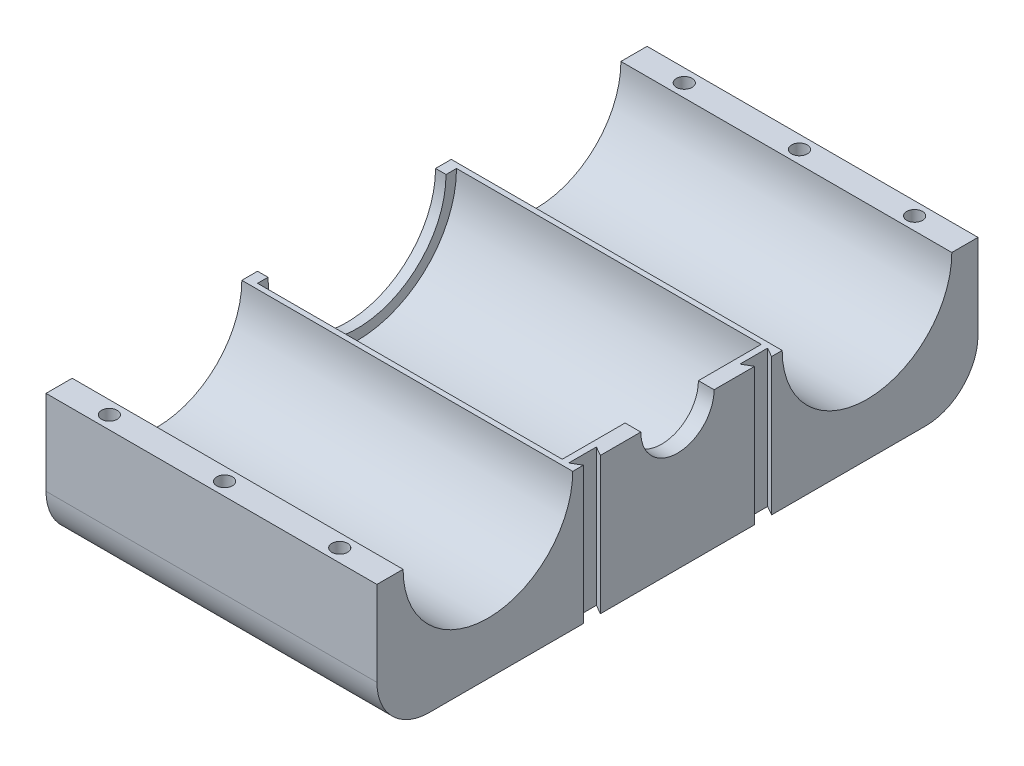
ISO-10303-21;
HEADER;
FILE_DESCRIPTION(('STEP AP214'),'2;1');
FILE_NAME('part.step','',(''),(''),'','','');
FILE_SCHEMA(('AUTOMOTIVE_DESIGN { 1 0 10303 214 1 1 1 1 }'));
ENDSEC;
DATA;
#1=APPLICATION_CONTEXT('core data for automotive mechanical design processes');
#2=APPLICATION_PROTOCOL_DEFINITION('international standard','automotive_design',2000,#1);
#3=PRODUCT_CONTEXT('',#1,'mechanical');
#4=PRODUCT('Part','Part','',(#3));
#5=PRODUCT_RELATED_PRODUCT_CATEGORY('part','',(#4));
#6=PRODUCT_DEFINITION_FORMATION('','',#4);
#7=PRODUCT_DEFINITION_CONTEXT('part definition',#1,'design');
#8=PRODUCT_DEFINITION('design','',#6,#7);
#9=PRODUCT_DEFINITION_SHAPE('','',#8);
#10=(LENGTH_UNIT() NAMED_UNIT(*) SI_UNIT(.MILLI.,.METRE.));
#11=(NAMED_UNIT(*) PLANE_ANGLE_UNIT() SI_UNIT($,.RADIAN.));
#12=(NAMED_UNIT(*) SI_UNIT($,.STERADIAN.) SOLID_ANGLE_UNIT());
#13=UNCERTAINTY_MEASURE_WITH_UNIT(LENGTH_MEASURE(1.E-05),#10,'distance_accuracy_value','');
#14=(GEOMETRIC_REPRESENTATION_CONTEXT(3) GLOBAL_UNCERTAINTY_ASSIGNED_CONTEXT((#13)) GLOBAL_UNIT_ASSIGNED_CONTEXT((#10,
#11,#12)) REPRESENTATION_CONTEXT('',''));
#15=CARTESIAN_POINT('',(0.,0.,0.));
#16=DIRECTION('',(0.,0.,1.));
#17=DIRECTION('',(1.,0.,0.));
#18=AXIS2_PLACEMENT_3D('',#15,#16,#17);
#19=CARTESIAN_POINT('',(116.940115370178,26.2,-57.4));
#20=DIRECTION('',(-1.,0.,0.));
#21=DIRECTION('',(0.,0.,1.));
#22=AXIS2_PLACEMENT_3D('',#19,#20,#21);
#23=CYLINDRICAL_SURFACE('',#22,19.);
#24=CARTESIAN_POINT('',(2.,26.2,-57.4));
#25=DIRECTION('',(-1.,0.,0.));
#26=DIRECTION('',(0.,0.,1.));
#27=AXIS2_PLACEMENT_3D('',#24,#25,#26);
#28=CIRCLE('',#27,19.);
#29=CARTESIAN_POINT('',(2.,26.2,-76.4));
#30=VERTEX_POINT('',#29);
#31=CARTESIAN_POINT('',(2.,26.2,-38.4));
#32=VERTEX_POINT('',#31);
#33=EDGE_CURVE('E207',#30,#32,#28,.T.);
#34=ORIENTED_EDGE('',*,*,#33,.T.);
#35=DIRECTION('',(-1.,0.,0.));
#36=VECTOR('',#35,1.);
#37=CARTESIAN_POINT('',(116.940115370178,26.2,-38.4));
#38=LINE('',#37,#36);
#39=CARTESIAN_POINT('',(60.2,26.2,-38.4));
#40=VERTEX_POINT('',#39);
#41=EDGE_CURVE('E218',#32,#40,#38,.F.);
#42=ORIENTED_EDGE('',*,*,#41,.T.);
#43=CARTESIAN_POINT('',(60.2,26.2,-57.4));
#44=DIRECTION('',(1.,0.,0.));
#45=DIRECTION('',(0.,0.,-1.));
#46=AXIS2_PLACEMENT_3D('',#43,#44,#45);
#47=CIRCLE('',#46,19.);
#48=CARTESIAN_POINT('',(60.2,26.2,-76.4));
#49=VERTEX_POINT('',#48);
#50=EDGE_CURVE('E229',#49,#40,#47,.F.);
#51=ORIENTED_EDGE('',*,*,#50,.F.);
#52=DIRECTION('',(-1.,0.,0.));
#53=VECTOR('',#52,1.);
#54=CARTESIAN_POINT('',(116.940115370178,26.2,-76.4));
#55=LINE('',#54,#53);
#56=EDGE_CURVE('E221',#49,#30,#55,.T.);
#57=ORIENTED_EDGE('',*,*,#56,.T.);
#58=EDGE_LOOP('',(#34,#42,#51,#57));
#59=FACE_BOUND('',#58,.T.);
#60=ADVANCED_FACE('F41',(#59),#23,.F.);
#61=CARTESIAN_POINT('',(63.2,26.2,0.));
#62=DIRECTION('',(0.,1.,0.));
#63=DIRECTION('',(0.,0.,1.));
#64=AXIS2_PLACEMENT_3D('',#61,#62,#63);
#65=PLANE('',#64);
#66=DIRECTION('',(1.,0.,0.));
#67=VECTOR('',#66,1.);
#68=CARTESIAN_POINT('',(-0.001000000000001,26.2,-50.4));
#69=LINE('',#68,#67);
#70=CARTESIAN_POINT('',(63.2,26.2,-50.4));
#71=VERTEX_POINT('',#70);
#72=CARTESIAN_POINT('',(60.2,26.2,-50.4));
#73=VERTEX_POINT('',#72);
#74=EDGE_CURVE('E418',#71,#73,#69,.F.);
#75=ORIENTED_EDGE('',*,*,#74,.T.);
#76=DIRECTION('',(0.,0.,-1.));
#77=VECTOR('',#76,1.);
#78=CARTESIAN_POINT('',(60.2,26.2,0.));
#79=LINE('',#78,#77);
#80=EDGE_CURVE('E228',#40,#73,#79,.T.);
#81=ORIENTED_EDGE('',*,*,#80,.F.);
#82=ORIENTED_EDGE('',*,*,#41,.F.);
#83=DIRECTION('',(0.,0.,-1.));
#84=VECTOR('',#83,1.);
#85=CARTESIAN_POINT('',(2.,26.2,-40.4));
#86=LINE('',#85,#84);
#87=CARTESIAN_POINT('',(2.,26.2,-40.4));
#88=VERTEX_POINT('',#87);
#89=EDGE_CURVE('E203',#32,#88,#86,.T.);
#90=ORIENTED_EDGE('',*,*,#89,.T.);
#91=DIRECTION('',(-1.,0.,0.));
#92=VECTOR('',#91,1.);
#93=CARTESIAN_POINT('',(2.,26.2,-40.4));
#94=LINE('',#93,#92);
#95=CARTESIAN_POINT('',(0.,26.2,-40.4));
#96=VERTEX_POINT('',#95);
#97=EDGE_CURVE('E398',#88,#96,#94,.T.);
#98=ORIENTED_EDGE('',*,*,#97,.T.);
#99=DIRECTION('',(0.,0.,-1.));
#100=VECTOR('',#99,1.);
#101=CARTESIAN_POINT('',(0.,26.2,0.));
#102=LINE('',#101,#100);
#103=CARTESIAN_POINT('',(0.,26.2,-37.4));
#104=VERTEX_POINT('',#103);
#105=EDGE_CURVE('E319',#104,#96,#102,.T.);
#106=ORIENTED_EDGE('',*,*,#105,.F.);
#107=DIRECTION('',(-1.,0.,0.));
#108=VECTOR('',#107,1.);
#109=CARTESIAN_POINT('',(63.2,26.2,-37.4));
#110=LINE('',#109,#108);
#111=CARTESIAN_POINT('',(63.2,26.2,-37.4));
#112=VERTEX_POINT('',#111);
#113=EDGE_CURVE('E344',#112,#104,#110,.T.);
#114=ORIENTED_EDGE('',*,*,#113,.F.);
#115=DIRECTION('',(0.,0.,-1.));
#116=VECTOR('',#115,1.);
#117=CARTESIAN_POINT('',(63.2,26.2,0.));
#118=LINE('',#117,#116);
#119=CARTESIAN_POINT('',(63.2,26.2,-39.425));
#120=VERTEX_POINT('',#119);
#121=EDGE_CURVE('E293',#112,#120,#118,.T.);
#122=ORIENTED_EDGE('',*,*,#121,.T.);
#123=DIRECTION('',(0.866025403784429,0.,-0.500000000000017));
#124=VECTOR('',#123,1.);
#125=CARTESIAN_POINT('',(61.4246479222421,26.2,-38.4));
#126=LINE('',#125,#124);
#127=CARTESIAN_POINT('',(61.4246479222421,26.2,-38.4));
#128=VERTEX_POINT('',#127);
#129=EDGE_CURVE('E276',#128,#120,#126,.T.);
#130=ORIENTED_EDGE('',*,*,#129,.F.);
#131=DIRECTION('',(0.,0.,1.));
#132=VECTOR('',#131,1.);
#133=CARTESIAN_POINT('',(61.424647922242,26.2,-43.7));
#134=LINE('',#133,#132);
#135=CARTESIAN_POINT('',(61.424647922242,26.2,-43.7));
#136=VERTEX_POINT('',#135);
#137=EDGE_CURVE('E273',#136,#128,#134,.T.);
#138=ORIENTED_EDGE('',*,*,#137,.F.);
#139=DIRECTION('',(-0.866025403784443,0.,-0.499999999999993));
#140=VECTOR('',#139,1.);
#141=CARTESIAN_POINT('',(63.2,26.2,-42.6750000000001));
#142=LINE('',#141,#140);
#143=CARTESIAN_POINT('',(63.2,26.2,-42.6750000000001));
#144=VERTEX_POINT('',#143);
#145=EDGE_CURVE('E270',#144,#136,#142,.T.);
#146=ORIENTED_EDGE('',*,*,#145,.F.);
#147=EDGE_CURVE('E297',#144,#71,#118,.T.);
#148=ORIENTED_EDGE('',*,*,#147,.T.);
#149=EDGE_LOOP('',(#75,#81,#82,#90,#98,#106,#114,#122,#130,#138,#146,#148));
#150=FACE_BOUND('',#149,.T.);
#151=ADVANCED_FACE('F226',(#150),#65,.T.);
#152=CARTESIAN_POINT('',(63.2,0.,0.));
#153=DIRECTION('',(1.,0.,0.));
#154=DIRECTION('',(0.,0.,-1.));
#155=AXIS2_PLACEMENT_3D('',#152,#153,#154);
#156=PLANE('',#155);
#157=CARTESIAN_POINT('',(63.2,26.2,-57.4));
#158=DIRECTION('',(1.,0.,0.));
#159=DIRECTION('',(0.,0.,-1.));
#160=AXIS2_PLACEMENT_3D('',#157,#158,#159);
#161=CIRCLE('',#160,7.);
#162=CARTESIAN_POINT('',(63.2,26.2,-64.4));
#163=VERTEX_POINT('',#162);
#164=EDGE_CURVE('E420',#71,#163,#161,.T.);
#165=ORIENTED_EDGE('',*,*,#164,.F.);
#166=ORIENTED_EDGE('',*,*,#147,.F.);
#167=DIRECTION('',(0.,1.,0.));
#168=VECTOR('',#167,1.);
#169=CARTESIAN_POINT('',(63.2,-0.001000000000001,-42.6750000000001));
#170=LINE('',#169,#168);
#171=CARTESIAN_POINT('',(63.2,0.,-42.6750000000001));
#172=VERTEX_POINT('',#171);
#173=EDGE_CURVE('E278',#172,#144,#170,.T.);
#174=ORIENTED_EDGE('',*,*,#173,.F.);
#175=DIRECTION('',(0.,0.,-1.));
#176=VECTOR('',#175,1.);
#177=CARTESIAN_POINT('',(63.2,0.,0.));
#178=LINE('',#177,#176);
#179=CARTESIAN_POINT('',(63.2,0.,-72.1249999999997));
#180=VERTEX_POINT('',#179);
#181=EDGE_CURVE('E310',#172,#180,#178,.T.);
#182=ORIENTED_EDGE('',*,*,#181,.T.);
#183=DIRECTION('',(0.,1.,0.));
#184=VECTOR('',#183,1.);
#185=CARTESIAN_POINT('',(63.2,-0.001000000000001,-72.1249999999997));
#186=LINE('',#185,#184);
#187=CARTESIAN_POINT('',(63.2,26.2,-72.1249999999997));
#188=VERTEX_POINT('',#187);
#189=EDGE_CURVE('E254',#180,#188,#186,.T.);
#190=ORIENTED_EDGE('',*,*,#189,.T.);
#191=EDGE_CURVE('E298',#163,#188,#118,.T.);
#192=ORIENTED_EDGE('',*,*,#191,.F.);
#193=EDGE_LOOP('',(#165,#166,#174,#182,#190,#192));
#194=FACE_BOUND('',#193,.T.);
#195=ADVANCED_FACE('F499',(#194),#156,.T.);
#196=DIRECTION('',(0.,1.,0.));
#197=VECTOR('',#196,1.);
#198=CARTESIAN_POINT('',(63.2,0.,0.));
#199=LINE('',#198,#197);
#200=CARTESIAN_POINT('',(63.2,10.,0.));
#201=VERTEX_POINT('',#200);
#202=CARTESIAN_POINT('',(63.2,26.2,0.));
#203=VERTEX_POINT('',#202);
#204=EDGE_CURVE('E304',#201,#203,#199,.T.);
#205=ORIENTED_EDGE('',*,*,#204,.F.);
#206=CARTESIAN_POINT('',(63.2,10.,-10.));
#207=DIRECTION('',(1.,0.,0.));
#208=DIRECTION('',(0.,0.,-1.));
#209=AXIS2_PLACEMENT_3D('',#206,#207,#208);
#210=CIRCLE('',#209,10.);
#211=CARTESIAN_POINT('',(63.2,0.,-10.));
#212=VERTEX_POINT('',#211);
#213=EDGE_CURVE('E12',#201,#212,#210,.T.);
#214=ORIENTED_EDGE('',*,*,#213,.T.);
#215=CARTESIAN_POINT('',(63.2,0.,-39.425));
#216=VERTEX_POINT('',#215);
#217=EDGE_CURVE('E307',#212,#216,#178,.T.);
#218=ORIENTED_EDGE('',*,*,#217,.T.);
#219=DIRECTION('',(0.,1.,0.));
#220=VECTOR('',#219,1.);
#221=CARTESIAN_POINT('',(63.2,-0.001000000000001,-39.425));
#222=LINE('',#221,#220);
#223=EDGE_CURVE('E279',#216,#120,#222,.T.);
#224=ORIENTED_EDGE('',*,*,#223,.T.);
#225=ORIENTED_EDGE('',*,*,#121,.F.);
#226=CARTESIAN_POINT('',(63.2,26.2,-21.2));
#227=DIRECTION('',(1.,0.,0.));
#228=DIRECTION('',(0.,0.,-1.));
#229=AXIS2_PLACEMENT_3D('',#226,#227,#228);
#230=CIRCLE('',#229,16.2);
#231=CARTESIAN_POINT('',(63.2,26.2,-5.));
#232=VERTEX_POINT('',#231);
#233=EDGE_CURVE('E296',#232,#112,#230,.T.);
#234=ORIENTED_EDGE('',*,*,#233,.F.);
#235=DIRECTION('',(0.,0.,-1.));
#236=VECTOR('',#235,1.);
#237=CARTESIAN_POINT('',(63.2,26.2,0.));
#238=LINE('',#237,#236);
#239=EDGE_CURVE('E301',#203,#232,#238,.T.);
#240=ORIENTED_EDGE('',*,*,#239,.F.);
#241=EDGE_LOOP('',(#205,#214,#218,#224,#225,#234,#240));
#242=FACE_BOUND('',#241,.T.);
#243=ADVANCED_FACE('F545',(#242),#156,.T.);
#244=CARTESIAN_POINT('',(63.2,26.2,-93.6));
#245=DIRECTION('',(-1.,0.,0.));
#246=DIRECTION('',(0.,0.,1.));
#247=AXIS2_PLACEMENT_3D('',#244,#245,#246);
#248=CYLINDRICAL_SURFACE('',#247,16.2);
#249=CARTESIAN_POINT('',(0.,26.2,-93.6));
#250=DIRECTION('',(1.,0.,0.));
#251=DIRECTION('',(0.,0.,-1.));
#252=AXIS2_PLACEMENT_3D('',#249,#250,#251);
#253=CIRCLE('',#252,16.2);
#254=CARTESIAN_POINT('',(0.,26.2,-77.4));
#255=VERTEX_POINT('',#254);
#256=CARTESIAN_POINT('',(0.,26.2,-109.8));
#257=VERTEX_POINT('',#256);
#258=EDGE_CURVE('E264',#255,#257,#253,.T.);
#259=ORIENTED_EDGE('',*,*,#258,.F.);
#260=DIRECTION('',(-1.,0.,0.));
#261=VECTOR('',#260,1.);
#262=CARTESIAN_POINT('',(63.2,26.2,-77.4));
#263=LINE('',#262,#261);
#264=CARTESIAN_POINT('',(63.2,26.2,-77.4));
#265=VERTEX_POINT('',#264);
#266=EDGE_CURVE('E346',#265,#255,#263,.T.);
#267=ORIENTED_EDGE('',*,*,#266,.F.);
#268=CARTESIAN_POINT('',(63.2,26.2,-93.6));
#269=DIRECTION('',(1.,0.,0.));
#270=DIRECTION('',(0.,0.,-1.));
#271=AXIS2_PLACEMENT_3D('',#268,#269,#270);
#272=CIRCLE('',#271,16.2);
#273=CARTESIAN_POINT('',(63.2,26.2,-109.8));
#274=VERTEX_POINT('',#273);
#275=EDGE_CURVE('E288',#265,#274,#272,.T.);
#276=ORIENTED_EDGE('',*,*,#275,.T.);
#277=DIRECTION('',(-1.,0.,0.));
#278=VECTOR('',#277,1.);
#279=CARTESIAN_POINT('',(63.2,26.2,-109.8));
#280=LINE('',#279,#278);
#281=EDGE_CURVE('E315',#274,#257,#280,.T.);
#282=ORIENTED_EDGE('',*,*,#281,.T.);
#283=EDGE_LOOP('',(#259,#267,#276,#282));
#284=FACE_BOUND('',#283,.T.);
#285=ADVANCED_FACE('F487',(#284),#248,.F.);
#286=DIRECTION('',(1.,0.,0.));
#287=VECTOR('',#286,1.);
#288=CARTESIAN_POINT('',(-0.001000000000001,26.2,-64.4));
#289=LINE('',#288,#287);
#290=CARTESIAN_POINT('',(60.2,26.2,-64.4));
#291=VERTEX_POINT('',#290);
#292=EDGE_CURVE('E414',#291,#163,#289,.T.);
#293=ORIENTED_EDGE('',*,*,#292,.T.);
#294=ORIENTED_EDGE('',*,*,#191,.T.);
#295=DIRECTION('',(0.866025403784411,0.,-0.500000000000048));
#296=VECTOR('',#295,1.);
#297=CARTESIAN_POINT('',(61.4246479222421,26.2,-71.0999999999997));
#298=LINE('',#297,#296);
#299=CARTESIAN_POINT('',(61.4246479222421,26.2,-71.0999999999997));
#300=VERTEX_POINT('',#299);
#301=EDGE_CURVE('E250',#300,#188,#298,.T.);
#302=ORIENTED_EDGE('',*,*,#301,.F.);
#303=DIRECTION('',(0.,0.,1.));
#304=VECTOR('',#303,1.);
#305=CARTESIAN_POINT('',(61.4246479222421,26.2,-76.4));
#306=LINE('',#305,#304);
#307=CARTESIAN_POINT('',(61.4246479222421,26.2,-76.4));
#308=VERTEX_POINT('',#307);
#309=EDGE_CURVE('E247',#308,#300,#306,.T.);
#310=ORIENTED_EDGE('',*,*,#309,.F.);
#311=DIRECTION('',(-0.866025403784364,0.,-0.500000000000129));
#312=VECTOR('',#311,1.);
#313=CARTESIAN_POINT('',(63.2,26.2,-75.3749999999997));
#314=LINE('',#313,#312);
#315=CARTESIAN_POINT('',(63.2,26.2,-75.3749999999997));
#316=VERTEX_POINT('',#315);
#317=EDGE_CURVE('E244',#316,#308,#314,.T.);
#318=ORIENTED_EDGE('',*,*,#317,.F.);
#319=EDGE_CURVE('E291',#316,#265,#118,.T.);
#320=ORIENTED_EDGE('',*,*,#319,.T.);
#321=ORIENTED_EDGE('',*,*,#266,.T.);
#322=CARTESIAN_POINT('',(0.,26.2,-74.4));
#323=VERTEX_POINT('',#322);
#324=EDGE_CURVE('E318',#323,#255,#102,.T.);
#325=ORIENTED_EDGE('',*,*,#324,.F.);
#326=DIRECTION('',(-1.,0.,0.));
#327=VECTOR('',#326,1.);
#328=CARTESIAN_POINT('',(2.,26.2,-74.4));
#329=LINE('',#328,#327);
#330=CARTESIAN_POINT('',(2.,26.2,-74.4));
#331=VERTEX_POINT('',#330);
#332=EDGE_CURVE('E401',#331,#323,#329,.T.);
#333=ORIENTED_EDGE('',*,*,#332,.F.);
#334=DIRECTION('',(0.,0.,-1.));
#335=VECTOR('',#334,1.);
#336=CARTESIAN_POINT('',(2.,26.2,-74.4));
#337=LINE('',#336,#335);
#338=EDGE_CURVE('E402',#331,#30,#337,.T.);
#339=ORIENTED_EDGE('',*,*,#338,.T.);
#340=ORIENTED_EDGE('',*,*,#56,.F.);
#341=EDGE_CURVE('E349',#291,#49,#79,.T.);
#342=ORIENTED_EDGE('',*,*,#341,.F.);
#343=EDGE_LOOP('',(#293,#294,#302,#310,#318,#320,#321,#325,#333,#339,#340,#342));
#344=FACE_BOUND('',#343,.T.);
#345=ADVANCED_FACE('F432',(#344),#65,.T.);
#346=CARTESIAN_POINT('',(63.2,26.2,-21.2));
#347=DIRECTION('',(-1.,0.,0.));
#348=DIRECTION('',(0.,0.,1.));
#349=AXIS2_PLACEMENT_3D('',#346,#347,#348);
#350=CYLINDRICAL_SURFACE('',#349,16.2);
#351=CARTESIAN_POINT('',(0.,26.2,-21.2));
#352=DIRECTION('',(1.,0.,0.));
#353=DIRECTION('',(0.,0.,-1.));
#354=AXIS2_PLACEMENT_3D('',#351,#352,#353);
#355=CIRCLE('',#354,16.2);
#356=CARTESIAN_POINT('',(0.,26.2,-5.));
#357=VERTEX_POINT('',#356);
#358=EDGE_CURVE('E321',#357,#104,#355,.T.);
#359=ORIENTED_EDGE('',*,*,#358,.F.);
#360=DIRECTION('',(-1.,0.,0.));
#361=VECTOR('',#360,1.);
#362=CARTESIAN_POINT('',(63.2,26.2,-5.));
#363=LINE('',#362,#361);
#364=EDGE_CURVE('E342',#232,#357,#363,.T.);
#365=ORIENTED_EDGE('',*,*,#364,.F.);
#366=ORIENTED_EDGE('',*,*,#233,.T.);
#367=ORIENTED_EDGE('',*,*,#113,.T.);
#368=EDGE_LOOP('',(#359,#365,#366,#367));
#369=FACE_BOUND('',#368,.T.);
#370=ADVANCED_FACE('F395',(#369),#350,.F.);
#371=CARTESIAN_POINT('',(63.2,26.2,0.));
#372=DIRECTION('',(0.,1.,0.));
#373=DIRECTION('',(0.,0.,1.));
#374=AXIS2_PLACEMENT_3D('',#371,#372,#373);
#375=PLANE('',#374);
#376=CARTESIAN_POINT('',(9.60000000000003,26.2000000000002,-2.50000000000001));
#377=DIRECTION('',(0.,1.,0.));
#378=DIRECTION('',(0.,0.,-1.));
#379=AXIS2_PLACEMENT_3D('',#376,#377,#378);
#380=CIRCLE('',#379,1.5);
#381=CARTESIAN_POINT('',(9.60000000000003,26.2000000000002,-4.00000000000001));
#382=VERTEX_POINT('',#381);
#383=EDGE_CURVE('E437',#382,#382,#380,.T.);
#384=ORIENTED_EDGE('',*,*,#383,.F.);
#385=EDGE_LOOP('',(#384));
#386=FACE_BOUND('',#385,.T.);
#387=CARTESIAN_POINT('',(31.6,26.2000000000002,-2.50000000000001));
#388=DIRECTION('',(0.,1.,0.));
#389=DIRECTION('',(0.,0.,-1.));
#390=AXIS2_PLACEMENT_3D('',#387,#388,#389);
#391=CIRCLE('',#390,1.49999999999999);
#392=CARTESIAN_POINT('',(31.6,26.2000000000002,-4.));
#393=VERTEX_POINT('',#392);
#394=EDGE_CURVE('E443',#393,#393,#391,.T.);
#395=ORIENTED_EDGE('',*,*,#394,.F.);
#396=EDGE_LOOP('',(#395));
#397=FACE_BOUND('',#396,.T.);
#398=CARTESIAN_POINT('',(53.6,26.2000000000002,-2.50000000000001));
#399=DIRECTION('',(0.,1.,0.));
#400=DIRECTION('',(0.,0.,-1.));
#401=AXIS2_PLACEMENT_3D('',#398,#399,#400);
#402=CIRCLE('',#401,1.5);
#403=CARTESIAN_POINT('',(53.6,26.2000000000002,-4.00000000000002));
#404=VERTEX_POINT('',#403);
#405=EDGE_CURVE('E449',#404,#404,#402,.T.);
#406=ORIENTED_EDGE('',*,*,#405,.F.);
#407=EDGE_LOOP('',(#406));
#408=FACE_BOUND('',#407,.T.);
#409=DIRECTION('',(0.,0.,-1.));
#410=VECTOR('',#409,1.);
#411=CARTESIAN_POINT('',(0.,26.2,0.));
#412=LINE('',#411,#410);
#413=CARTESIAN_POINT('',(0.,26.2,0.));
#414=VERTEX_POINT('',#413);
#415=EDGE_CURVE('E324',#414,#357,#412,.T.);
#416=ORIENTED_EDGE('',*,*,#415,.F.);
#417=DIRECTION('',(-1.,0.,0.));
#418=VECTOR('',#417,1.);
#419=CARTESIAN_POINT('',(63.2,26.2,0.));
#420=LINE('',#419,#418);
#421=EDGE_CURVE('E339',#203,#414,#420,.T.);
#422=ORIENTED_EDGE('',*,*,#421,.F.);
#423=ORIENTED_EDGE('',*,*,#239,.T.);
#424=ORIENTED_EDGE('',*,*,#364,.T.);
#425=EDGE_LOOP('',(#416,#422,#423,#424));
#426=FACE_BOUND('',#425,.T.);
#427=ADVANCED_FACE('F390',(#386,#397,#408,#426),#375,.T.);
#428=CARTESIAN_POINT('',(63.2,0.,0.));
#429=DIRECTION('',(0.,0.,1.));
#430=DIRECTION('',(1.,0.,0.));
#431=AXIS2_PLACEMENT_3D('',#428,#429,#430);
#432=PLANE('',#431);
#433=DIRECTION('',(0.,1.,0.));
#434=VECTOR('',#433,1.);
#435=CARTESIAN_POINT('',(0.,0.,0.));
#436=LINE('',#435,#434);
#437=CARTESIAN_POINT('',(0.,10.,0.));
#438=VERTEX_POINT('',#437);
#439=EDGE_CURVE('E327',#438,#414,#436,.T.);
#440=ORIENTED_EDGE('',*,*,#439,.F.);
#441=DIRECTION('',(-1.,0.,0.));
#442=VECTOR('',#441,1.);
#443=CARTESIAN_POINT('',(63.2,10.,0.));
#444=LINE('',#443,#442);
#445=EDGE_CURVE('E49',#438,#201,#444,.F.);
#446=ORIENTED_EDGE('',*,*,#445,.T.);
#447=ORIENTED_EDGE('',*,*,#204,.T.);
#448=ORIENTED_EDGE('',*,*,#421,.T.);
#449=EDGE_LOOP('',(#440,#446,#447,#448));
#450=FACE_BOUND('',#449,.T.);
#451=ADVANCED_FACE('F385',(#450),#432,.T.);
#452=CARTESIAN_POINT('',(63.2,0.,0.));
#453=DIRECTION('',(0.,1.,0.));
#454=DIRECTION('',(0.,0.,1.));
#455=AXIS2_PLACEMENT_3D('',#452,#453,#454);
#456=PLANE('',#455);
#457=DIRECTION('',(0.,0.,-1.));
#458=VECTOR('',#457,1.);
#459=CARTESIAN_POINT('',(0.,0.,0.));
#460=LINE('',#459,#458);
#461=CARTESIAN_POINT('',(0.,0.,-10.));
#462=VERTEX_POINT('',#461);
#463=CARTESIAN_POINT('',(0.,0.,-104.8));
#464=VERTEX_POINT('',#463);
#465=EDGE_CURVE('E329',#462,#464,#460,.T.);
#466=ORIENTED_EDGE('',*,*,#465,.T.);
#467=DIRECTION('',(-1.,0.,0.));
#468=VECTOR('',#467,1.);
#469=CARTESIAN_POINT('',(63.2,0.,-104.8));
#470=LINE('',#469,#468);
#471=CARTESIAN_POINT('',(63.2,0.,-104.8));
#472=VERTEX_POINT('',#471);
#473=EDGE_CURVE('E63',#464,#472,#470,.F.);
#474=ORIENTED_EDGE('',*,*,#473,.T.);
#475=CARTESIAN_POINT('',(63.2,0.,-75.3749999999997));
#476=VERTEX_POINT('',#475);
#477=EDGE_CURVE('E306',#476,#472,#178,.T.);
#478=ORIENTED_EDGE('',*,*,#477,.F.);
#479=DIRECTION('',(0.866025403784365,0.,0.500000000000129));
#480=VECTOR('',#479,1.);
#481=CARTESIAN_POINT('',(63.2,0.,-75.3749999999997));
#482=LINE('',#481,#480);
#483=CARTESIAN_POINT('',(61.4246479222421,0.,-76.4));
#484=VERTEX_POINT('',#483);
#485=EDGE_CURVE('E257',#484,#476,#482,.T.);
#486=ORIENTED_EDGE('',*,*,#485,.F.);
#487=DIRECTION('',(0.,0.,-1.));
#488=VECTOR('',#487,1.);
#489=CARTESIAN_POINT('',(61.4246479222421,0.,-76.4));
#490=LINE('',#489,#488);
#491=CARTESIAN_POINT('',(61.4246479222421,0.,-71.0999999999997));
#492=VERTEX_POINT('',#491);
#493=EDGE_CURVE('E237',#492,#484,#490,.T.);
#494=ORIENTED_EDGE('',*,*,#493,.F.);
#495=DIRECTION('',(-0.866025403784411,0.,0.500000000000048));
#496=VECTOR('',#495,1.);
#497=CARTESIAN_POINT('',(61.4246479222421,0.,-71.0999999999997));
#498=LINE('',#497,#496);
#499=EDGE_CURVE('E240',#180,#492,#498,.T.);
#500=ORIENTED_EDGE('',*,*,#499,.F.);
#501=ORIENTED_EDGE('',*,*,#181,.F.);
#502=DIRECTION('',(0.866025403784443,0.,0.499999999999993));
#503=VECTOR('',#502,1.);
#504=CARTESIAN_POINT('',(63.2,0.,-42.6750000000001));
#505=LINE('',#504,#503);
#506=CARTESIAN_POINT('',(61.424647922242,0.,-43.7));
#507=VERTEX_POINT('',#506);
#508=EDGE_CURVE('E241',#507,#172,#505,.T.);
#509=ORIENTED_EDGE('',*,*,#508,.F.);
#510=DIRECTION('',(0.,0.,-1.));
#511=VECTOR('',#510,1.);
#512=CARTESIAN_POINT('',(61.424647922242,0.,-43.7));
#513=LINE('',#512,#511);
#514=CARTESIAN_POINT('',(61.4246479222421,0.,-38.4));
#515=VERTEX_POINT('',#514);
#516=EDGE_CURVE('E231',#515,#507,#513,.T.);
#517=ORIENTED_EDGE('',*,*,#516,.F.);
#518=DIRECTION('',(-0.866025403784429,0.,0.500000000000017));
#519=VECTOR('',#518,1.);
#520=CARTESIAN_POINT('',(61.4246479222421,0.,-38.4));
#521=LINE('',#520,#519);
#522=EDGE_CURVE('E267',#216,#515,#521,.T.);
#523=ORIENTED_EDGE('',*,*,#522,.F.);
#524=ORIENTED_EDGE('',*,*,#217,.F.);
#525=DIRECTION('',(-1.,0.,0.));
#526=VECTOR('',#525,1.);
#527=CARTESIAN_POINT('',(0.,0.,-10.));
#528=LINE('',#527,#526);
#529=EDGE_CURVE('E358',#212,#462,#528,.T.);
#530=ORIENTED_EDGE('',*,*,#529,.T.);
#531=EDGE_LOOP('',(#466,#474,#478,#486,#494,#500,#501,#509,#517,#523,#524,#530));
#532=FACE_BOUND('',#531,.T.);
#533=ADVANCED_FACE('F379',(#532),#456,.F.);
#534=CARTESIAN_POINT('',(63.2,0.,-114.8));
#535=DIRECTION('',(0.,0.,1.));
#536=DIRECTION('',(1.,0.,0.));
#537=AXIS2_PLACEMENT_3D('',#534,#535,#536);
#538=PLANE('',#537);
#539=DIRECTION('',(0.,1.,0.));
#540=VECTOR('',#539,1.);
#541=CARTESIAN_POINT('',(63.2,0.,-114.8));
#542=LINE('',#541,#540);
#543=CARTESIAN_POINT('',(63.2,10.,-114.8));
#544=VERTEX_POINT('',#543);
#545=CARTESIAN_POINT('',(63.2,26.2,-114.8));
#546=VERTEX_POINT('',#545);
#547=EDGE_CURVE('E309',#544,#546,#542,.T.);
#548=ORIENTED_EDGE('',*,*,#547,.F.);
#549=DIRECTION('',(-1.,0.,0.));
#550=VECTOR('',#549,1.);
#551=CARTESIAN_POINT('',(63.2,10.,-114.8));
#552=LINE('',#551,#550);
#553=CARTESIAN_POINT('',(0.,10.,-114.8));
#554=VERTEX_POINT('',#553);
#555=EDGE_CURVE('E351',#544,#554,#552,.T.);
#556=ORIENTED_EDGE('',*,*,#555,.T.);
#557=DIRECTION('',(0.,1.,0.));
#558=VECTOR('',#557,1.);
#559=CARTESIAN_POINT('',(0.,0.,-114.8));
#560=LINE('',#559,#558);
#561=CARTESIAN_POINT('',(0.,26.2,-114.8));
#562=VERTEX_POINT('',#561);
#563=EDGE_CURVE('E331',#554,#562,#560,.T.);
#564=ORIENTED_EDGE('',*,*,#563,.T.);
#565=DIRECTION('',(-1.,0.,0.));
#566=VECTOR('',#565,1.);
#567=CARTESIAN_POINT('',(63.2,26.2,-114.8));
#568=LINE('',#567,#566);
#569=EDGE_CURVE('E336',#546,#562,#568,.T.);
#570=ORIENTED_EDGE('',*,*,#569,.F.);
#571=EDGE_LOOP('',(#548,#556,#564,#570));
#572=FACE_BOUND('',#571,.T.);
#573=ADVANCED_FACE('F373',(#572),#538,.F.);
#574=CARTESIAN_POINT('',(63.2,26.2000000000002,0.));
#575=DIRECTION('',(0.,1.,0.));
#576=DIRECTION('',(0.,0.,1.));
#577=AXIS2_PLACEMENT_3D('',#574,#575,#576);
#578=PLANE('',#577);
#579=CARTESIAN_POINT('',(53.6,26.2,-112.3));
#580=DIRECTION('',(0.,1.,0.));
#581=DIRECTION('',(0.,0.,1.));
#582=AXIS2_PLACEMENT_3D('',#579,#580,#581);
#583=CIRCLE('',#582,1.5);
#584=CARTESIAN_POINT('',(53.6,26.2,-110.8));
#585=VERTEX_POINT('',#584);
#586=EDGE_CURVE('E455',#585,#585,#583,.T.);
#587=ORIENTED_EDGE('',*,*,#586,.F.);
#588=EDGE_LOOP('',(#587));
#589=FACE_BOUND('',#588,.T.);
#590=CARTESIAN_POINT('',(31.6,26.2,-112.3));
#591=DIRECTION('',(0.,1.,0.));
#592=DIRECTION('',(0.,0.,1.));
#593=AXIS2_PLACEMENT_3D('',#590,#591,#592);
#594=CIRCLE('',#593,1.5);
#595=CARTESIAN_POINT('',(31.6,26.2,-110.8));
#596=VERTEX_POINT('',#595);
#597=EDGE_CURVE('E461',#596,#596,#594,.T.);
#598=ORIENTED_EDGE('',*,*,#597,.F.);
#599=EDGE_LOOP('',(#598));
#600=FACE_BOUND('',#599,.T.);
#601=CARTESIAN_POINT('',(9.6,26.2,-112.3));
#602=DIRECTION('',(0.,1.,0.));
#603=DIRECTION('',(0.,0.,1.));
#604=AXIS2_PLACEMENT_3D('',#601,#602,#603);
#605=CIRCLE('',#604,1.5);
#606=CARTESIAN_POINT('',(9.6,26.2,-110.8));
#607=VERTEX_POINT('',#606);
#608=EDGE_CURVE('E409',#607,#607,#605,.T.);
#609=ORIENTED_EDGE('',*,*,#608,.F.);
#610=EDGE_LOOP('',(#609));
#611=FACE_BOUND('',#610,.T.);
#612=DIRECTION('',(0.,0.,-1.));
#613=VECTOR('',#612,1.);
#614=CARTESIAN_POINT('',(0.,26.2000000000002,0.));
#615=LINE('',#614,#613);
#616=EDGE_CURVE('E292',#257,#562,#615,.T.);
#617=ORIENTED_EDGE('',*,*,#616,.F.);
#618=ORIENTED_EDGE('',*,*,#281,.F.);
#619=DIRECTION('',(0.,0.,-1.));
#620=VECTOR('',#619,1.);
#621=CARTESIAN_POINT('',(63.2,26.2000000000002,0.));
#622=LINE('',#621,#620);
#623=EDGE_CURVE('E312',#274,#546,#622,.T.);
#624=ORIENTED_EDGE('',*,*,#623,.T.);
#625=ORIENTED_EDGE('',*,*,#569,.T.);
#626=EDGE_LOOP('',(#617,#618,#624,#625));
#627=FACE_BOUND('',#626,.T.);
#628=ADVANCED_FACE('F476',(#589,#600,#611,#627),#578,.T.);
#629=ORIENTED_EDGE('',*,*,#477,.T.);
#630=CARTESIAN_POINT('',(63.2,10.,-104.8));
#631=DIRECTION('',(1.,0.,0.));
#632=DIRECTION('',(0.,0.,-1.));
#633=AXIS2_PLACEMENT_3D('',#630,#631,#632);
#634=CIRCLE('',#633,10.);
#635=EDGE_CURVE('E362',#472,#544,#634,.T.);
#636=ORIENTED_EDGE('',*,*,#635,.T.);
#637=ORIENTED_EDGE('',*,*,#547,.T.);
#638=ORIENTED_EDGE('',*,*,#623,.F.);
#639=ORIENTED_EDGE('',*,*,#275,.F.);
#640=ORIENTED_EDGE('',*,*,#319,.F.);
#641=DIRECTION('',(0.,1.,0.));
#642=VECTOR('',#641,1.);
#643=CARTESIAN_POINT('',(63.2,-0.001000000000001,-75.3749999999997));
#644=LINE('',#643,#642);
#645=EDGE_CURVE('E253',#476,#316,#644,.T.);
#646=ORIENTED_EDGE('',*,*,#645,.F.);
#647=EDGE_LOOP('',(#629,#636,#637,#638,#639,#640,#646));
#648=FACE_BOUND('',#647,.T.);
#649=ADVANCED_FACE('F366',(#648),#156,.T.);
#650=CARTESIAN_POINT('',(0.,0.,0.));
#651=DIRECTION('',(1.,0.,0.));
#652=DIRECTION('',(0.,0.,-1.));
#653=AXIS2_PLACEMENT_3D('',#650,#651,#652);
#654=PLANE('',#653);
#655=ORIENTED_EDGE('',*,*,#563,.F.);
#656=CARTESIAN_POINT('',(0.,10.,-104.8));
#657=DIRECTION('',(1.,0.,0.));
#658=DIRECTION('',(0.,0.,-1.));
#659=AXIS2_PLACEMENT_3D('',#656,#657,#658);
#660=CIRCLE('',#659,10.);
#661=EDGE_CURVE('E356',#554,#464,#660,.F.);
#662=ORIENTED_EDGE('',*,*,#661,.T.);
#663=ORIENTED_EDGE('',*,*,#465,.F.);
#664=CARTESIAN_POINT('',(0.,10.,-10.));
#665=DIRECTION('',(1.,0.,0.));
#666=DIRECTION('',(0.,0.,-1.));
#667=AXIS2_PLACEMENT_3D('',#664,#665,#666);
#668=CIRCLE('',#667,10.);
#669=EDGE_CURVE('E354',#462,#438,#668,.F.);
#670=ORIENTED_EDGE('',*,*,#669,.T.);
#671=ORIENTED_EDGE('',*,*,#439,.T.);
#672=ORIENTED_EDGE('',*,*,#415,.T.);
#673=ORIENTED_EDGE('',*,*,#358,.T.);
#674=ORIENTED_EDGE('',*,*,#105,.T.);
#675=CARTESIAN_POINT('',(0.,26.2,-57.4));
#676=DIRECTION('',(1.,0.,0.));
#677=DIRECTION('',(0.,0.,1.));
#678=AXIS2_PLACEMENT_3D('',#675,#676,#677);
#679=CIRCLE('',#678,17.);
#680=EDGE_CURVE('E222',#96,#323,#679,.T.);
#681=ORIENTED_EDGE('',*,*,#680,.T.);
#682=ORIENTED_EDGE('',*,*,#324,.T.);
#683=ORIENTED_EDGE('',*,*,#258,.T.);
#684=ORIENTED_EDGE('',*,*,#616,.T.);
#685=EDGE_LOOP('',(#655,#662,#663,#670,#671,#672,#673,#674,#681,#682,#683,#684));
#686=FACE_BOUND('',#685,.T.);
#687=ADVANCED_FACE('F378',(#686),#654,.F.);
#688=CARTESIAN_POINT('',(61.4246479222421,-0.001000000000001,-38.4));
#689=DIRECTION('',(0.500000000000017,0.,0.866025403784429));
#690=DIRECTION('',(0.866025403784429,0.,-0.500000000000017));
#691=AXIS2_PLACEMENT_3D('',#688,#689,#690);
#692=PLANE('',#691);
#693=ORIENTED_EDGE('',*,*,#522,.T.);
#694=DIRECTION('',(0.,1.,0.));
#695=VECTOR('',#694,1.);
#696=CARTESIAN_POINT('',(61.4246479222421,-0.001000000000001,-38.4));
#697=LINE('',#696,#695);
#698=EDGE_CURVE('E282',#515,#128,#697,.T.);
#699=ORIENTED_EDGE('',*,*,#698,.T.);
#700=ORIENTED_EDGE('',*,*,#129,.T.);
#701=ORIENTED_EDGE('',*,*,#223,.F.);
#702=EDGE_LOOP('',(#693,#699,#700,#701));
#703=FACE_BOUND('',#702,.T.);
#704=ADVANCED_FACE('F539',(#703),#692,.F.);
#705=CARTESIAN_POINT('',(61.424647922242,-0.001000000000001,-43.7));
#706=DIRECTION('',(-1.,0.,0.));
#707=DIRECTION('',(0.,0.,1.));
#708=AXIS2_PLACEMENT_3D('',#705,#706,#707);
#709=PLANE('',#708);
#710=ORIENTED_EDGE('',*,*,#516,.T.);
#711=DIRECTION('',(0.,1.,0.));
#712=VECTOR('',#711,1.);
#713=CARTESIAN_POINT('',(61.424647922242,-0.001000000000001,-43.7));
#714=LINE('',#713,#712);
#715=EDGE_CURVE('E284',#507,#136,#714,.T.);
#716=ORIENTED_EDGE('',*,*,#715,.T.);
#717=ORIENTED_EDGE('',*,*,#137,.T.);
#718=ORIENTED_EDGE('',*,*,#698,.F.);
#719=EDGE_LOOP('',(#710,#716,#717,#718));
#720=FACE_BOUND('',#719,.T.);
#721=ADVANCED_FACE('F533',(#720),#709,.F.);
#722=CARTESIAN_POINT('',(63.2,-0.001000000000001,-42.6750000000001));
#723=DIRECTION('',(0.499999999999993,0.,-0.866025403784443));
#724=DIRECTION('',(-0.866025403784443,0.,-0.499999999999993));
#725=AXIS2_PLACEMENT_3D('',#722,#723,#724);
#726=PLANE('',#725);
#727=ORIENTED_EDGE('',*,*,#508,.T.);
#728=ORIENTED_EDGE('',*,*,#173,.T.);
#729=ORIENTED_EDGE('',*,*,#145,.T.);
#730=ORIENTED_EDGE('',*,*,#715,.F.);
#731=EDGE_LOOP('',(#727,#728,#729,#730));
#732=FACE_BOUND('',#731,.T.);
#733=ADVANCED_FACE('F529',(#732),#726,.F.);
#734=CARTESIAN_POINT('',(61.4246479222421,-0.001000000000001,-71.0999999999997));
#735=DIRECTION('',(0.500000000000048,0.,0.866025403784411));
#736=DIRECTION('',(0.866025403784411,0.,-0.500000000000048));
#737=AXIS2_PLACEMENT_3D('',#734,#735,#736);
#738=PLANE('',#737);
#739=ORIENTED_EDGE('',*,*,#499,.T.);
#740=DIRECTION('',(0.,1.,0.));
#741=VECTOR('',#740,1.);
#742=CARTESIAN_POINT('',(61.4246479222421,-0.001000000000001,-71.0999999999997));
#743=LINE('',#742,#741);
#744=EDGE_CURVE('E258',#492,#300,#743,.T.);
#745=ORIENTED_EDGE('',*,*,#744,.T.);
#746=ORIENTED_EDGE('',*,*,#301,.T.);
#747=ORIENTED_EDGE('',*,*,#189,.F.);
#748=EDGE_LOOP('',(#739,#745,#746,#747));
#749=FACE_BOUND('',#748,.T.);
#750=ADVANCED_FACE('F496',(#749),#738,.F.);
#751=CARTESIAN_POINT('',(61.4246479222421,-0.001000000000001,-76.4));
#752=DIRECTION('',(-1.,0.,0.));
#753=DIRECTION('',(0.,0.,1.));
#754=AXIS2_PLACEMENT_3D('',#751,#752,#753);
#755=PLANE('',#754);
#756=ORIENTED_EDGE('',*,*,#493,.T.);
#757=DIRECTION('',(0.,1.,0.));
#758=VECTOR('',#757,1.);
#759=CARTESIAN_POINT('',(61.4246479222421,-0.001000000000001,-76.4));
#760=LINE('',#759,#758);
#761=EDGE_CURVE('E260',#484,#308,#760,.T.);
#762=ORIENTED_EDGE('',*,*,#761,.T.);
#763=ORIENTED_EDGE('',*,*,#309,.T.);
#764=ORIENTED_EDGE('',*,*,#744,.F.);
#765=EDGE_LOOP('',(#756,#762,#763,#764));
#766=FACE_BOUND('',#765,.T.);
#767=ADVANCED_FACE('F507',(#766),#755,.F.);
#768=CARTESIAN_POINT('',(63.2,-0.001000000000001,-75.3749999999997));
#769=DIRECTION('',(0.500000000000129,0.,-0.866025403784364));
#770=DIRECTION('',(-0.866025403784365,0.,-0.500000000000129));
#771=AXIS2_PLACEMENT_3D('',#768,#769,#770);
#772=PLANE('',#771);
#773=ORIENTED_EDGE('',*,*,#485,.T.);
#774=ORIENTED_EDGE('',*,*,#645,.T.);
#775=ORIENTED_EDGE('',*,*,#317,.T.);
#776=ORIENTED_EDGE('',*,*,#761,.F.);
#777=EDGE_LOOP('',(#773,#774,#775,#776));
#778=FACE_BOUND('',#777,.T.);
#779=ADVANCED_FACE('F509',(#778),#772,.F.);
#780=CARTESIAN_POINT('',(60.2,0.,0.));
#781=DIRECTION('',(1.,0.,0.));
#782=DIRECTION('',(0.,0.,-1.));
#783=AXIS2_PLACEMENT_3D('',#780,#781,#782);
#784=PLANE('',#783);
#785=ORIENTED_EDGE('',*,*,#80,.T.);
#786=CARTESIAN_POINT('',(60.2,26.2,-57.4));
#787=DIRECTION('',(1.,0.,0.));
#788=DIRECTION('',(0.,0.,-1.));
#789=AXIS2_PLACEMENT_3D('',#786,#787,#788);
#790=CIRCLE('',#789,7.);
#791=EDGE_CURVE('E233',#291,#73,#790,.F.);
#792=ORIENTED_EDGE('',*,*,#791,.F.);
#793=ORIENTED_EDGE('',*,*,#341,.T.);
#794=ORIENTED_EDGE('',*,*,#50,.T.);
#795=EDGE_LOOP('',(#785,#792,#793,#794));
#796=FACE_BOUND('',#795,.T.);
#797=ADVANCED_FACE('F430',(#796),#784,.F.);
#798=CARTESIAN_POINT('',(-0.001000000000001,26.2,-57.4));
#799=DIRECTION('',(1.,0.,0.));
#800=DIRECTION('',(0.,0.,-1.));
#801=AXIS2_PLACEMENT_3D('',#798,#799,#800);
#802=CYLINDRICAL_SURFACE('',#801,7.);
#803=ORIENTED_EDGE('',*,*,#164,.T.);
#804=ORIENTED_EDGE('',*,*,#292,.F.);
#805=ORIENTED_EDGE('',*,*,#791,.T.);
#806=ORIENTED_EDGE('',*,*,#74,.F.);
#807=EDGE_LOOP('',(#803,#804,#805,#806));
#808=FACE_BOUND('',#807,.T.);
#809=ADVANCED_FACE('F423',(#808),#802,.F.);
#810=CARTESIAN_POINT('',(2.,26.2,-57.4));
#811=DIRECTION('',(-1.,0.,0.));
#812=DIRECTION('',(0.,0.,1.));
#813=AXIS2_PLACEMENT_3D('',#810,#811,#812);
#814=CYLINDRICAL_SURFACE('',#813,17.);
#815=ORIENTED_EDGE('',*,*,#680,.F.);
#816=ORIENTED_EDGE('',*,*,#97,.F.);
#817=CARTESIAN_POINT('',(2.,26.2,-57.4));
#818=DIRECTION('',(1.,0.,0.));
#819=DIRECTION('',(0.,0.,1.));
#820=AXIS2_PLACEMENT_3D('',#817,#818,#819);
#821=CIRCLE('',#820,17.);
#822=EDGE_CURVE('E210',#88,#331,#821,.T.);
#823=ORIENTED_EDGE('',*,*,#822,.T.);
#824=ORIENTED_EDGE('',*,*,#332,.T.);
#825=EDGE_LOOP('',(#815,#816,#823,#824));
#826=FACE_BOUND('',#825,.T.);
#827=ADVANCED_FACE('F405',(#826),#814,.F.);
#828=CARTESIAN_POINT('',(2.,26.2,-57.4));
#829=DIRECTION('',(-1.,0.,0.));
#830=DIRECTION('',(0.,0.,1.));
#831=AXIS2_PLACEMENT_3D('',#828,#829,#830);
#832=PLANE('',#831);
#833=ORIENTED_EDGE('',*,*,#33,.F.);
#834=ORIENTED_EDGE('',*,*,#338,.F.);
#835=ORIENTED_EDGE('',*,*,#822,.F.);
#836=ORIENTED_EDGE('',*,*,#89,.F.);
#837=EDGE_LOOP('',(#833,#834,#835,#836));
#838=FACE_BOUND('',#837,.T.);
#839=ADVANCED_FACE('F205',(#838),#832,.F.);
#840=CARTESIAN_POINT('',(63.2,10.,-104.8));
#841=DIRECTION('',(-1.,0.,0.));
#842=DIRECTION('',(0.,0.,1.));
#843=AXIS2_PLACEMENT_3D('',#840,#841,#842);
#844=CYLINDRICAL_SURFACE('',#843,10.);
#845=ORIENTED_EDGE('',*,*,#635,.F.);
#846=ORIENTED_EDGE('',*,*,#473,.F.);
#847=ORIENTED_EDGE('',*,*,#661,.F.);
#848=ORIENTED_EDGE('',*,*,#555,.F.);
#849=EDGE_LOOP('',(#845,#846,#847,#848));
#850=FACE_BOUND('',#849,.T.);
#851=ADVANCED_FACE('F375',(#850),#844,.T.);
#852=CARTESIAN_POINT('',(63.2,10.,-10.));
#853=DIRECTION('',(1.,0.,0.));
#854=DIRECTION('',(0.,0.,-1.));
#855=AXIS2_PLACEMENT_3D('',#852,#853,#854);
#856=CYLINDRICAL_SURFACE('',#855,10.);
#857=ORIENTED_EDGE('',*,*,#213,.F.);
#858=ORIENTED_EDGE('',*,*,#445,.F.);
#859=ORIENTED_EDGE('',*,*,#669,.F.);
#860=ORIENTED_EDGE('',*,*,#529,.F.);
#861=EDGE_LOOP('',(#857,#858,#859,#860));
#862=FACE_BOUND('',#861,.T.);
#863=ADVANCED_FACE('F43',(#862),#856,.T.);
#864=CARTESIAN_POINT('',(9.6,11.2,-112.3));
#865=DIRECTION('',(0.,1.,0.));
#866=DIRECTION('',(0.,0.,1.));
#867=AXIS2_PLACEMENT_3D('',#864,#865,#866);
#868=CYLINDRICAL_SURFACE('',#867,1.5);
#869=CARTESIAN_POINT('',(9.6,11.2,-112.3));
#870=DIRECTION('',(0.,1.,0.));
#871=DIRECTION('',(0.,0.,1.));
#872=AXIS2_PLACEMENT_3D('',#869,#870,#871);
#873=CIRCLE('',#872,1.5);
#874=CARTESIAN_POINT('',(9.6,11.2,-110.8));
#875=VERTEX_POINT('',#874);
#876=EDGE_CURVE('E406',#875,#875,#873,.T.);
#877=ORIENTED_EDGE('',*,*,#876,.F.);
#878=EDGE_LOOP('',(#877));
#879=FACE_BOUND('',#878,.T.);
#880=ORIENTED_EDGE('',*,*,#608,.T.);
#881=EDGE_LOOP('',(#880));
#882=FACE_BOUND('',#881,.T.);
#883=ADVANCED_FACE('F566',(#879,#882),#868,.F.);
#884=CARTESIAN_POINT('',(9.6,11.2,-112.3));
#885=DIRECTION('',(0.,1.,0.));
#886=DIRECTION('',(0.,0.,1.));
#887=AXIS2_PLACEMENT_3D('',#884,#885,#886);
#888=PLANE('',#887);
#889=ORIENTED_EDGE('',*,*,#876,.T.);
#890=EDGE_LOOP('',(#889));
#891=FACE_BOUND('',#890,.T.);
#892=ADVANCED_FACE('F472',(#891),#888,.T.);
#893=CARTESIAN_POINT('',(31.6,11.2,-112.3));
#894=DIRECTION('',(0.,1.,0.));
#895=DIRECTION('',(0.,0.,1.));
#896=AXIS2_PLACEMENT_3D('',#893,#894,#895);
#897=CYLINDRICAL_SURFACE('',#896,1.5);
#898=CARTESIAN_POINT('',(31.6,11.2,-112.3));
#899=DIRECTION('',(0.,1.,0.));
#900=DIRECTION('',(0.,0.,1.));
#901=AXIS2_PLACEMENT_3D('',#898,#899,#900);
#902=CIRCLE('',#901,1.5);
#903=CARTESIAN_POINT('',(31.6,11.2,-110.8));
#904=VERTEX_POINT('',#903);
#905=EDGE_CURVE('E435',#904,#904,#902,.T.);
#906=ORIENTED_EDGE('',*,*,#905,.F.);
#907=EDGE_LOOP('',(#906));
#908=FACE_BOUND('',#907,.T.);
#909=ORIENTED_EDGE('',*,*,#597,.T.);
#910=EDGE_LOOP('',(#909));
#911=FACE_BOUND('',#910,.T.);
#912=ADVANCED_FACE('F469',(#908,#911),#897,.F.);
#913=CARTESIAN_POINT('',(31.6,11.2,-112.3));
#914=DIRECTION('',(0.,1.,0.));
#915=DIRECTION('',(0.,0.,1.));
#916=AXIS2_PLACEMENT_3D('',#913,#914,#915);
#917=PLANE('',#916);
#918=ORIENTED_EDGE('',*,*,#905,.T.);
#919=EDGE_LOOP('',(#918));
#920=FACE_BOUND('',#919,.T.);
#921=ADVANCED_FACE('F467',(#920),#917,.T.);
#922=CARTESIAN_POINT('',(53.6,11.2,-112.3));
#923=DIRECTION('',(0.,1.,0.));
#924=DIRECTION('',(0.,0.,1.));
#925=AXIS2_PLACEMENT_3D('',#922,#923,#924);
#926=CYLINDRICAL_SURFACE('',#925,1.5);
#927=CARTESIAN_POINT('',(53.6,11.2,-112.3));
#928=DIRECTION('',(0.,1.,0.));
#929=DIRECTION('',(0.,0.,1.));
#930=AXIS2_PLACEMENT_3D('',#927,#928,#929);
#931=CIRCLE('',#930,1.5);
#932=CARTESIAN_POINT('',(53.6,11.2,-110.8));
#933=VERTEX_POINT('',#932);
#934=EDGE_CURVE('E458',#933,#933,#931,.T.);
#935=ORIENTED_EDGE('',*,*,#934,.F.);
#936=EDGE_LOOP('',(#935));
#937=FACE_BOUND('',#936,.T.);
#938=ORIENTED_EDGE('',*,*,#586,.T.);
#939=EDGE_LOOP('',(#938));
#940=FACE_BOUND('',#939,.T.);
#941=ADVANCED_FACE('F603',(#937,#940),#926,.F.);
#942=CARTESIAN_POINT('',(53.6,11.2,-112.3));
#943=DIRECTION('',(0.,1.,0.));
#944=DIRECTION('',(0.,0.,1.));
#945=AXIS2_PLACEMENT_3D('',#942,#943,#944);
#946=PLANE('',#945);
#947=ORIENTED_EDGE('',*,*,#934,.T.);
#948=EDGE_LOOP('',(#947));
#949=FACE_BOUND('',#948,.T.);
#950=ADVANCED_FACE('F598',(#949),#946,.T.);
#951=CARTESIAN_POINT('',(53.6,11.2000000000002,-2.49999999999999));
#952=DIRECTION('',(0.,1.,0.));
#953=DIRECTION('',(0.,0.,1.));
#954=AXIS2_PLACEMENT_3D('',#951,#952,#953);
#955=CYLINDRICAL_SURFACE('',#954,1.5);
#956=CARTESIAN_POINT('',(53.6,11.2000000000002,-2.49999999999999));
#957=DIRECTION('',(0.,1.,0.));
#958=DIRECTION('',(0.,0.,-1.));
#959=AXIS2_PLACEMENT_3D('',#956,#957,#958);
#960=CIRCLE('',#959,1.5);
#961=CARTESIAN_POINT('',(53.6,11.2000000000002,-3.99999999999999));
#962=VERTEX_POINT('',#961);
#963=EDGE_CURVE('E452',#962,#962,#960,.T.);
#964=ORIENTED_EDGE('',*,*,#963,.F.);
#965=EDGE_LOOP('',(#964));
#966=FACE_BOUND('',#965,.T.);
#967=ORIENTED_EDGE('',*,*,#405,.T.);
#968=EDGE_LOOP('',(#967));
#969=FACE_BOUND('',#968,.T.);
#970=ADVANCED_FACE('F595',(#966,#969),#955,.F.);
#971=CARTESIAN_POINT('',(53.6,11.2000000000002,-2.49999999999999));
#972=DIRECTION('',(0.,-1.,0.));
#973=DIRECTION('',(0.,0.,-1.));
#974=AXIS2_PLACEMENT_3D('',#971,#972,#973);
#975=PLANE('',#974);
#976=ORIENTED_EDGE('',*,*,#963,.T.);
#977=EDGE_LOOP('',(#976));
#978=FACE_BOUND('',#977,.T.);
#979=ADVANCED_FACE('F590',(#978),#975,.F.);
#980=CARTESIAN_POINT('',(31.6,11.2000000000002,-2.49999999999999));
#981=DIRECTION('',(0.,1.,0.));
#982=DIRECTION('',(0.,0.,1.));
#983=AXIS2_PLACEMENT_3D('',#980,#981,#982);
#984=CYLINDRICAL_SURFACE('',#983,1.49999999999999);
#985=CARTESIAN_POINT('',(31.6,11.2000000000002,-2.49999999999999));
#986=DIRECTION('',(0.,1.,0.));
#987=DIRECTION('',(0.,0.,-1.));
#988=AXIS2_PLACEMENT_3D('',#985,#986,#987);
#989=CIRCLE('',#988,1.49999999999999);
#990=CARTESIAN_POINT('',(31.6,11.2000000000002,-3.99999999999998));
#991=VERTEX_POINT('',#990);
#992=EDGE_CURVE('E446',#991,#991,#989,.T.);
#993=ORIENTED_EDGE('',*,*,#992,.F.);
#994=EDGE_LOOP('',(#993));
#995=FACE_BOUND('',#994,.T.);
#996=ORIENTED_EDGE('',*,*,#394,.T.);
#997=EDGE_LOOP('',(#996));
#998=FACE_BOUND('',#997,.T.);
#999=ADVANCED_FACE('F587',(#995,#998),#984,.F.);
#1000=CARTESIAN_POINT('',(31.6,11.2000000000002,-2.49999999999999));
#1001=DIRECTION('',(0.,-1.,0.));
#1002=DIRECTION('',(0.,0.,-1.));
#1003=AXIS2_PLACEMENT_3D('',#1000,#1001,#1002);
#1004=PLANE('',#1003);
#1005=ORIENTED_EDGE('',*,*,#992,.T.);
#1006=EDGE_LOOP('',(#1005));
#1007=FACE_BOUND('',#1006,.T.);
#1008=ADVANCED_FACE('F582',(#1007),#1004,.F.);
#1009=CARTESIAN_POINT('',(9.60000000000003,11.2000000000002,-2.49999999999999));
#1010=DIRECTION('',(0.,1.,0.));
#1011=DIRECTION('',(0.,0.,1.));
#1012=AXIS2_PLACEMENT_3D('',#1009,#1010,#1011);
#1013=CYLINDRICAL_SURFACE('',#1012,1.5);
#1014=CARTESIAN_POINT('',(9.60000000000003,11.2000000000002,-2.49999999999999));
#1015=DIRECTION('',(0.,1.,0.));
#1016=DIRECTION('',(0.,0.,-1.));
#1017=AXIS2_PLACEMENT_3D('',#1014,#1015,#1016);
#1018=CIRCLE('',#1017,1.5);
#1019=CARTESIAN_POINT('',(9.60000000000003,11.2000000000002,-3.99999999999999));
#1020=VERTEX_POINT('',#1019);
#1021=EDGE_CURVE('E440',#1020,#1020,#1018,.T.);
#1022=ORIENTED_EDGE('',*,*,#1021,.F.);
#1023=EDGE_LOOP('',(#1022));
#1024=FACE_BOUND('',#1023,.T.);
#1025=ORIENTED_EDGE('',*,*,#383,.T.);
#1026=EDGE_LOOP('',(#1025));
#1027=FACE_BOUND('',#1026,.T.);
#1028=ADVANCED_FACE('F578',(#1024,#1027),#1013,.F.);
#1029=CARTESIAN_POINT('',(9.60000000000003,11.2000000000002,-2.49999999999999));
#1030=DIRECTION('',(0.,-1.,0.));
#1031=DIRECTION('',(0.,0.,-1.));
#1032=AXIS2_PLACEMENT_3D('',#1029,#1030,#1031);
#1033=PLANE('',#1032);
#1034=ORIENTED_EDGE('',*,*,#1021,.T.);
#1035=EDGE_LOOP('',(#1034));
#1036=FACE_BOUND('',#1035,.T.);
#1037=ADVANCED_FACE('F581',(#1036),#1033,.F.);
#1038=CLOSED_SHELL('',(#60,#151,#195,#243,#285,#345,#370,#427,#451,#533,#573,#628,#649,#687,
#704,#721,#733,#750,#767,#779,#797,#809,#827,#839,#851,#863,#883,#892,#912,#921,#941,#950,#970,
#979,#999,#1008,#1028,#1037));
#1039=MANIFOLD_SOLID_BREP('B2',#1038);
#1040=ADVANCED_BREP_SHAPE_REPRESENTATION('',(#18,#1039),#14);
#1041=SHAPE_DEFINITION_REPRESENTATION(#9,#1040);
ENDSEC;
END-ISO-10303-21;
